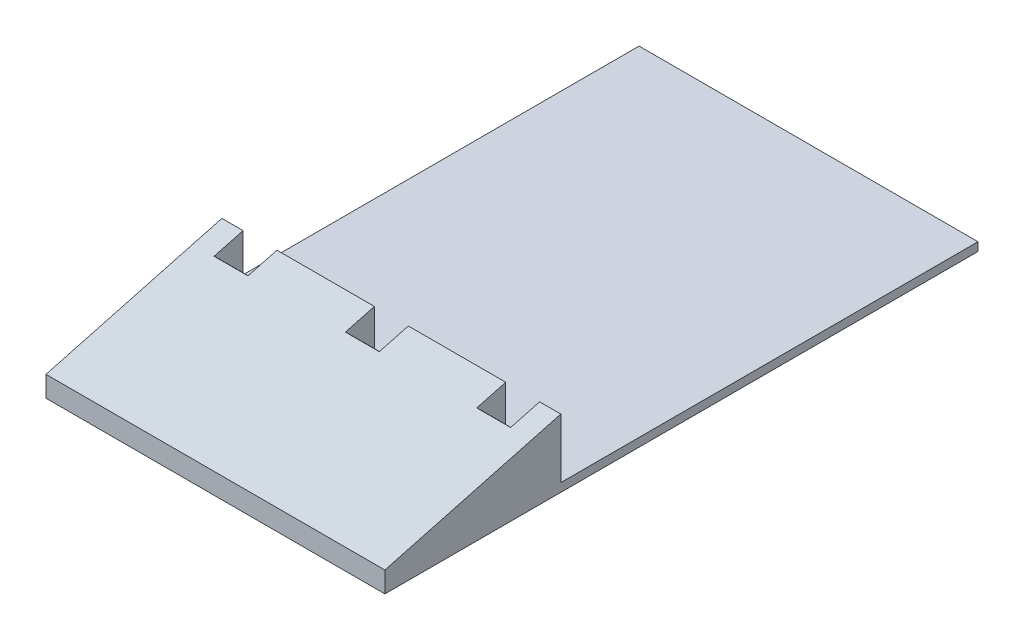
ISO-10303-21;
HEADER;
FILE_DESCRIPTION(('STEP AP214'),'2;1');
FILE_NAME('part.step','',(''),(''),'','','');
FILE_SCHEMA(('AUTOMOTIVE_DESIGN { 1 0 10303 214 1 1 1 1 }'));
ENDSEC;
DATA;
#1=APPLICATION_CONTEXT('core data for automotive mechanical design processes');
#2=APPLICATION_PROTOCOL_DEFINITION('international standard','automotive_design',2000,#1);
#3=PRODUCT_CONTEXT('',#1,'mechanical');
#4=PRODUCT('Part','Part','',(#3));
#5=PRODUCT_RELATED_PRODUCT_CATEGORY('part','',(#4));
#6=PRODUCT_DEFINITION_FORMATION('','',#4);
#7=PRODUCT_DEFINITION_CONTEXT('part definition',#1,'design');
#8=PRODUCT_DEFINITION('design','',#6,#7);
#9=PRODUCT_DEFINITION_SHAPE('','',#8);
#10=(LENGTH_UNIT() NAMED_UNIT(*) SI_UNIT(.MILLI.,.METRE.));
#11=(NAMED_UNIT(*) PLANE_ANGLE_UNIT() SI_UNIT($,.RADIAN.));
#12=(NAMED_UNIT(*) SI_UNIT($,.STERADIAN.) SOLID_ANGLE_UNIT());
#13=UNCERTAINTY_MEASURE_WITH_UNIT(LENGTH_MEASURE(1.E-05),#10,'distance_accuracy_value','');
#14=(GEOMETRIC_REPRESENTATION_CONTEXT(3) GLOBAL_UNCERTAINTY_ASSIGNED_CONTEXT((#13)) GLOBAL_UNIT_ASSIGNED_CONTEXT((#10,
#11,#12)) REPRESENTATION_CONTEXT('',''));
#15=CARTESIAN_POINT('',(0.,0.,0.));
#16=DIRECTION('',(0.,0.,1.));
#17=DIRECTION('',(1.,0.,0.));
#18=AXIS2_PLACEMENT_3D('',#15,#16,#17);
#19=CARTESIAN_POINT('',(-200.,80.077464993119,-207.601036066479));
#20=DIRECTION('',(0.,0.,-1.));
#21=DIRECTION('',(-1.,0.,0.));
#22=AXIS2_PLACEMENT_3D('',#19,#20,#21);
#23=PLANE('',#22);
#24=DIRECTION('',(1.,0.,0.));
#25=VECTOR('',#24,1.);
#26=CARTESIAN_POINT('',(-200.,80.077464993119,-207.601036066479));
#27=LINE('',#26,#25);
#28=CARTESIAN_POINT('',(-200.,80.077464993119,-207.601036066479));
#29=VERTEX_POINT('',#28);
#30=CARTESIAN_POINT('',(-175.,80.077464993119,-207.601036066479));
#31=VERTEX_POINT('',#30);
#32=EDGE_CURVE('E539',#29,#31,#27,.T.);
#33=ORIENTED_EDGE('',*,*,#32,.T.);
#34=DIRECTION('',(0.,1.,0.));
#35=VECTOR('',#34,1.);
#36=CARTESIAN_POINT('',(-175.,10.,-207.601036066479));
#37=LINE('',#36,#35);
#38=CARTESIAN_POINT('',(-175.,10.,-207.601036066479));
#39=VERTEX_POINT('',#38);
#40=EDGE_CURVE('E444',#39,#31,#37,.T.);
#41=ORIENTED_EDGE('',*,*,#40,.F.);
#42=DIRECTION('',(-1.,0.,0.));
#43=VECTOR('',#42,1.);
#44=CARTESIAN_POINT('',(0.,10.,-207.601036066479));
#45=LINE('',#44,#43);
#46=CARTESIAN_POINT('',(-200.,10.,-207.601036066479));
#47=VERTEX_POINT('',#46);
#48=EDGE_CURVE('E538',#39,#47,#45,.T.);
#49=ORIENTED_EDGE('',*,*,#48,.T.);
#50=DIRECTION('',(0.,1.,0.));
#51=VECTOR('',#50,1.);
#52=CARTESIAN_POINT('',(-200.,80.077464993119,-207.601036066479));
#53=LINE('',#52,#51);
#54=EDGE_CURVE('E526',#47,#29,#53,.T.);
#55=ORIENTED_EDGE('',*,*,#54,.T.);
#56=EDGE_LOOP('',(#33,#41,#49,#55));
#57=FACE_BOUND('',#56,.T.);
#58=ADVANCED_FACE('F46',(#57),#23,.T.);
#59=CARTESIAN_POINT('',(-200.,24.4644117044917,0.));
#60=DIRECTION('',(0.,0.965941500833546,0.258760539819032));
#61=DIRECTION('',(0.,-0.258760539819032,0.965941500833546));
#62=AXIS2_PLACEMENT_3D('',#59,#60,#61);
#63=PLANE('',#62);
#64=DIRECTION('',(0.,-0.258760539819032,0.965941500833546));
#65=VECTOR('',#64,1.);
#66=CARTESIAN_POINT('',(-135.,80.077464993119,-207.601036066479));
#67=LINE('',#66,#65);
#68=CARTESIAN_POINT('',(-135.,80.077464993119,-207.601036066479));
#69=VERTEX_POINT('',#68);
#70=CARTESIAN_POINT('',(-135.,70.9185634064497,-173.411266827316));
#71=VERTEX_POINT('',#70);
#72=EDGE_CURVE('E459',#69,#71,#67,.T.);
#73=ORIENTED_EDGE('',*,*,#72,.T.);
#74=DIRECTION('',(-1.,0.,0.));
#75=VECTOR('',#74,1.);
#76=CARTESIAN_POINT('',(-135.,70.9185634064497,-173.411266827316));
#77=LINE('',#76,#75);
#78=CARTESIAN_POINT('',(-175.,70.9185634064497,-173.411266827316));
#79=VERTEX_POINT('',#78);
#80=EDGE_CURVE('E463',#71,#79,#77,.T.);
#81=ORIENTED_EDGE('',*,*,#80,.T.);
#82=DIRECTION('',(0.,-0.258760539819032,0.965941500833546));
#83=VECTOR('',#82,1.);
#84=CARTESIAN_POINT('',(-175.,80.077464993119,-207.601036066479));
#85=LINE('',#84,#83);
#86=EDGE_CURVE('E447',#31,#79,#85,.T.);
#87=ORIENTED_EDGE('',*,*,#86,.F.);
#88=ORIENTED_EDGE('',*,*,#32,.F.);
#89=DIRECTION('',(0.,-0.258760539819032,0.965941500833546));
#90=VECTOR('',#89,1.);
#91=CARTESIAN_POINT('',(-200.,51.6292787330018,-101.405231438355));
#92=LINE('',#91,#90);
#93=CARTESIAN_POINT('',(-200.,24.4644117044917,0.));
#94=VERTEX_POINT('',#93);
#95=EDGE_CURVE('E529',#29,#94,#92,.T.);
#96=ORIENTED_EDGE('',*,*,#95,.T.);
#97=DIRECTION('',(1.,0.,0.));
#98=VECTOR('',#97,1.);
#99=CARTESIAN_POINT('',(-200.,24.4644117044917,0.));
#100=LINE('',#99,#98);
#101=CARTESIAN_POINT('',(200.,24.4644117044917,0.));
#102=VERTEX_POINT('',#101);
#103=EDGE_CURVE('E534',#94,#102,#100,.T.);
#104=ORIENTED_EDGE('',*,*,#103,.T.);
#105=DIRECTION('',(0.,-0.258760539819032,0.965941500833546));
#106=VECTOR('',#105,1.);
#107=CARTESIAN_POINT('',(200.,51.6292787330018,-101.405231438355));
#108=LINE('',#107,#106);
#109=CARTESIAN_POINT('',(200.,80.077464993119,-207.601036066479));
#110=VERTEX_POINT('',#109);
#111=EDGE_CURVE('E522',#110,#102,#108,.T.);
#112=ORIENTED_EDGE('',*,*,#111,.F.);
#113=CARTESIAN_POINT('',(175.,80.077464993119,-207.601036066479));
#114=VERTEX_POINT('',#113);
#115=EDGE_CURVE('E533',#114,#110,#27,.T.);
#116=ORIENTED_EDGE('',*,*,#115,.F.);
#117=DIRECTION('',(0.,-0.258760539819032,0.965941500833546));
#118=VECTOR('',#117,1.);
#119=CARTESIAN_POINT('',(175.,24.4644117044917,0.));
#120=LINE('',#119,#118);
#121=CARTESIAN_POINT('',(175.,70.9185634064497,-173.411266827316));
#122=VERTEX_POINT('',#121);
#123=EDGE_CURVE('E496',#114,#122,#120,.T.);
#124=ORIENTED_EDGE('',*,*,#123,.T.);
#125=DIRECTION('',(-1.,0.,0.));
#126=VECTOR('',#125,1.);
#127=CARTESIAN_POINT('',(175.,70.9185634064497,-173.411266827316));
#128=LINE('',#127,#126);
#129=CARTESIAN_POINT('',(135.,70.9185634064497,-173.411266827316));
#130=VERTEX_POINT('',#129);
#131=EDGE_CURVE('E485',#122,#130,#128,.T.);
#132=ORIENTED_EDGE('',*,*,#131,.T.);
#133=DIRECTION('',(0.,-0.258760539819032,0.965941500833546));
#134=VECTOR('',#133,1.);
#135=CARTESIAN_POINT('',(135.,24.4644117044917,0.));
#136=LINE('',#135,#134);
#137=CARTESIAN_POINT('',(135.,80.077464993119,-207.601036066479));
#138=VERTEX_POINT('',#137);
#139=EDGE_CURVE('E493',#138,#130,#136,.T.);
#140=ORIENTED_EDGE('',*,*,#139,.F.);
#141=CARTESIAN_POINT('',(20.,80.077464993119,-207.601036066479));
#142=VERTEX_POINT('',#141);
#143=EDGE_CURVE('E544',#142,#138,#27,.T.);
#144=ORIENTED_EDGE('',*,*,#143,.F.);
#145=DIRECTION('',(0.,0.258760539819032,-0.965941500833546));
#146=VECTOR('',#145,1.);
#147=CARTESIAN_POINT('',(20.,24.4644117044917,0.));
#148=LINE('',#147,#146);
#149=CARTESIAN_POINT('',(20.,70.9185634064497,-173.411266827316));
#150=VERTEX_POINT('',#149);
#151=EDGE_CURVE('E515',#150,#142,#148,.T.);
#152=ORIENTED_EDGE('',*,*,#151,.F.);
#153=DIRECTION('',(-1.,0.,0.));
#154=VECTOR('',#153,1.);
#155=CARTESIAN_POINT('',(20.,70.9185634064497,-173.411266827316));
#156=LINE('',#155,#154);
#157=CARTESIAN_POINT('',(-20.,70.9185634064497,-173.411266827316));
#158=VERTEX_POINT('',#157);
#159=EDGE_CURVE('E507',#150,#158,#156,.T.);
#160=ORIENTED_EDGE('',*,*,#159,.T.);
#161=DIRECTION('',(0.,0.258760539819032,-0.965941500833546));
#162=VECTOR('',#161,1.);
#163=CARTESIAN_POINT('',(-20.,24.4644117044917,0.));
#164=LINE('',#163,#162);
#165=CARTESIAN_POINT('',(-20.,80.077464993119,-207.601036066479));
#166=VERTEX_POINT('',#165);
#167=EDGE_CURVE('E511',#158,#166,#164,.T.);
#168=ORIENTED_EDGE('',*,*,#167,.T.);
#169=EDGE_CURVE('E543',#69,#166,#27,.T.);
#170=ORIENTED_EDGE('',*,*,#169,.F.);
#171=EDGE_LOOP('',(#73,#81,#87,#88,#96,#104,#112,#116,#124,#132,#140,#144,#152,#160,#168,#170));
#172=FACE_BOUND('',#171,.T.);
#173=ADVANCED_FACE('F672',(#172),#63,.T.);
#174=CARTESIAN_POINT('',(200.,10.,-207.601036066479));
#175=VERTEX_POINT('',#174);
#176=CARTESIAN_POINT('',(175.,10.,-207.601036066479));
#177=VERTEX_POINT('',#176);
#178=EDGE_CURVE('E545',#175,#177,#45,.T.);
#179=ORIENTED_EDGE('',*,*,#178,.T.);
#180=DIRECTION('',(0.,-1.,0.));
#181=VECTOR('',#180,1.);
#182=CARTESIAN_POINT('',(175.,80.077464993119,-207.601036066479));
#183=LINE('',#182,#181);
#184=EDGE_CURVE('E481',#114,#177,#183,.T.);
#185=ORIENTED_EDGE('',*,*,#184,.F.);
#186=ORIENTED_EDGE('',*,*,#115,.T.);
#187=DIRECTION('',(0.,1.,0.));
#188=VECTOR('',#187,1.);
#189=CARTESIAN_POINT('',(200.,80.077464993119,-207.601036066479));
#190=LINE('',#189,#188);
#191=EDGE_CURVE('E518',#175,#110,#190,.T.);
#192=ORIENTED_EDGE('',*,*,#191,.F.);
#193=EDGE_LOOP('',(#179,#185,#186,#192));
#194=FACE_BOUND('',#193,.T.);
#195=ADVANCED_FACE('F686',(#194),#23,.T.);
#196=CARTESIAN_POINT('',(-200.,10.,0.));
#197=DIRECTION('',(0.,0.,-1.));
#198=DIRECTION('',(-1.,0.,0.));
#199=AXIS2_PLACEMENT_3D('',#196,#197,#198);
#200=PLANE('',#199);
#201=DIRECTION('',(1.,0.,0.));
#202=VECTOR('',#201,1.);
#203=CARTESIAN_POINT('',(-200.,0.,0.));
#204=LINE('',#203,#202);
#205=CARTESIAN_POINT('',(-200.,0.,0.));
#206=VERTEX_POINT('',#205);
#207=CARTESIAN_POINT('',(200.,0.,0.));
#208=VERTEX_POINT('',#207);
#209=EDGE_CURVE('E549',#206,#208,#204,.T.);
#210=ORIENTED_EDGE('',*,*,#209,.T.);
#211=DIRECTION('',(0.,-1.,0.));
#212=VECTOR('',#211,1.);
#213=CARTESIAN_POINT('',(200.,10.,0.));
#214=LINE('',#213,#212);
#215=EDGE_CURVE('E586',#102,#208,#214,.T.);
#216=ORIENTED_EDGE('',*,*,#215,.F.);
#217=ORIENTED_EDGE('',*,*,#103,.F.);
#218=DIRECTION('',(0.,-1.,0.));
#219=VECTOR('',#218,1.);
#220=CARTESIAN_POINT('',(-200.,10.,0.));
#221=LINE('',#220,#219);
#222=EDGE_CURVE('E563',#94,#206,#221,.T.);
#223=ORIENTED_EDGE('',*,*,#222,.T.);
#224=EDGE_LOOP('',(#210,#216,#217,#223));
#225=FACE_BOUND('',#224,.T.);
#226=ADVANCED_FACE('F693',(#225),#200,.F.);
#227=CARTESIAN_POINT('',(200.,10.,0.));
#228=DIRECTION('',(-1.,0.,0.));
#229=DIRECTION('',(0.,0.,1.));
#230=AXIS2_PLACEMENT_3D('',#227,#228,#229);
#231=PLANE('',#230);
#232=DIRECTION('',(0.,0.,-1.));
#233=VECTOR('',#232,1.);
#234=CARTESIAN_POINT('',(200.,10.,0.));
#235=LINE('',#234,#233);
#236=CARTESIAN_POINT('',(200.,10.,-700.));
#237=VERTEX_POINT('',#236);
#238=EDGE_CURVE('E552',#175,#237,#235,.T.);
#239=ORIENTED_EDGE('',*,*,#238,.F.);
#240=ORIENTED_EDGE('',*,*,#191,.T.);
#241=ORIENTED_EDGE('',*,*,#111,.T.);
#242=ORIENTED_EDGE('',*,*,#215,.T.);
#243=DIRECTION('',(0.,0.,-1.));
#244=VECTOR('',#243,1.);
#245=CARTESIAN_POINT('',(200.,0.,0.));
#246=LINE('',#245,#244);
#247=CARTESIAN_POINT('',(200.,0.,-700.));
#248=VERTEX_POINT('',#247);
#249=EDGE_CURVE('E567',#208,#248,#246,.T.);
#250=ORIENTED_EDGE('',*,*,#249,.T.);
#251=DIRECTION('',(0.,-1.,0.));
#252=VECTOR('',#251,1.);
#253=CARTESIAN_POINT('',(200.,10.,-700.));
#254=LINE('',#253,#252);
#255=EDGE_CURVE('E582',#237,#248,#254,.T.);
#256=ORIENTED_EDGE('',*,*,#255,.F.);
#257=EDGE_LOOP('',(#239,#240,#241,#242,#250,#256));
#258=FACE_BOUND('',#257,.T.);
#259=ADVANCED_FACE('F689',(#258),#231,.F.);
#260=CARTESIAN_POINT('',(200.,10.,-700.));
#261=DIRECTION('',(0.,0.,1.));
#262=DIRECTION('',(1.,0.,0.));
#263=AXIS2_PLACEMENT_3D('',#260,#261,#262);
#264=PLANE('',#263);
#265=DIRECTION('',(-1.,0.,0.));
#266=VECTOR('',#265,1.);
#267=CARTESIAN_POINT('',(200.,0.,-700.));
#268=LINE('',#267,#266);
#269=CARTESIAN_POINT('',(-200.,0.,-700.));
#270=VERTEX_POINT('',#269);
#271=EDGE_CURVE('E570',#248,#270,#268,.T.);
#272=ORIENTED_EDGE('',*,*,#271,.T.);
#273=DIRECTION('',(0.,-1.,0.));
#274=VECTOR('',#273,1.);
#275=CARTESIAN_POINT('',(-200.,10.,-700.));
#276=LINE('',#275,#274);
#277=CARTESIAN_POINT('',(-200.,10.,-700.));
#278=VERTEX_POINT('',#277);
#279=EDGE_CURVE('E578',#278,#270,#276,.T.);
#280=ORIENTED_EDGE('',*,*,#279,.F.);
#281=DIRECTION('',(-1.,0.,0.));
#282=VECTOR('',#281,1.);
#283=CARTESIAN_POINT('',(200.,10.,-700.));
#284=LINE('',#283,#282);
#285=EDGE_CURVE('E555',#237,#278,#284,.T.);
#286=ORIENTED_EDGE('',*,*,#285,.F.);
#287=ORIENTED_EDGE('',*,*,#255,.T.);
#288=EDGE_LOOP('',(#272,#280,#286,#287));
#289=FACE_BOUND('',#288,.T.);
#290=ADVANCED_FACE('F699',(#289),#264,.F.);
#291=CARTESIAN_POINT('',(-200.,10.,-700.));
#292=DIRECTION('',(1.,0.,0.));
#293=DIRECTION('',(0.,0.,-1.));
#294=AXIS2_PLACEMENT_3D('',#291,#292,#293);
#295=PLANE('',#294);
#296=DIRECTION('',(0.,0.,1.));
#297=VECTOR('',#296,1.);
#298=CARTESIAN_POINT('',(-200.,0.,-700.));
#299=LINE('',#298,#297);
#300=EDGE_CURVE('E556',#270,#206,#299,.T.);
#301=ORIENTED_EDGE('',*,*,#300,.T.);
#302=ORIENTED_EDGE('',*,*,#222,.F.);
#303=ORIENTED_EDGE('',*,*,#95,.F.);
#304=ORIENTED_EDGE('',*,*,#54,.F.);
#305=DIRECTION('',(0.,0.,1.));
#306=VECTOR('',#305,1.);
#307=CARTESIAN_POINT('',(-200.,10.,-700.));
#308=LINE('',#307,#306);
#309=EDGE_CURVE('E559',#278,#47,#308,.T.);
#310=ORIENTED_EDGE('',*,*,#309,.F.);
#311=ORIENTED_EDGE('',*,*,#279,.T.);
#312=EDGE_LOOP('',(#301,#302,#303,#304,#310,#311));
#313=FACE_BOUND('',#312,.T.);
#314=ADVANCED_FACE('F704',(#313),#295,.F.);
#315=CARTESIAN_POINT('',(0.,10.,0.));
#316=DIRECTION('',(0.,1.,0.));
#317=DIRECTION('',(0.,0.,1.));
#318=AXIS2_PLACEMENT_3D('',#315,#316,#317);
#319=PLANE('',#318);
#320=ORIENTED_EDGE('',*,*,#178,.F.);
#321=ORIENTED_EDGE('',*,*,#238,.T.);
#322=ORIENTED_EDGE('',*,*,#285,.T.);
#323=ORIENTED_EDGE('',*,*,#309,.T.);
#324=ORIENTED_EDGE('',*,*,#48,.F.);
#325=DIRECTION('',(-1.,0.,0.));
#326=VECTOR('',#325,1.);
#327=CARTESIAN_POINT('',(-135.,10.,-207.601036066479));
#328=LINE('',#327,#326);
#329=CARTESIAN_POINT('',(-135.,10.,-207.601036066479));
#330=VERTEX_POINT('',#329);
#331=EDGE_CURVE('E467',#330,#39,#328,.T.);
#332=ORIENTED_EDGE('',*,*,#331,.F.);
#333=CARTESIAN_POINT('',(-124.5,10.,-207.601036066479));
#334=VERTEX_POINT('',#333);
#335=EDGE_CURVE('E551',#334,#330,#45,.T.);
#336=ORIENTED_EDGE('',*,*,#335,.F.);
#337=CARTESIAN_POINT('',(-30.5,10.,-207.601036066479));
#338=VERTEX_POINT('',#337);
#339=EDGE_CURVE('E635',#338,#334,#45,.T.);
#340=ORIENTED_EDGE('',*,*,#339,.F.);
#341=CARTESIAN_POINT('',(30.5,10.,-207.601036066479));
#342=VERTEX_POINT('',#341);
#343=EDGE_CURVE('E627',#342,#338,#45,.T.);
#344=ORIENTED_EDGE('',*,*,#343,.F.);
#345=CARTESIAN_POINT('',(124.5,10.,-207.601036066479));
#346=VERTEX_POINT('',#345);
#347=EDGE_CURVE('E631',#346,#342,#45,.T.);
#348=ORIENTED_EDGE('',*,*,#347,.F.);
#349=CARTESIAN_POINT('',(135.,10.,-207.601036066479));
#350=VERTEX_POINT('',#349);
#351=EDGE_CURVE('E550',#350,#346,#45,.T.);
#352=ORIENTED_EDGE('',*,*,#351,.F.);
#353=DIRECTION('',(-1.,0.,0.));
#354=VECTOR('',#353,1.);
#355=CARTESIAN_POINT('',(175.,10.,-207.601036066479));
#356=LINE('',#355,#354);
#357=EDGE_CURVE('E489',#177,#350,#356,.T.);
#358=ORIENTED_EDGE('',*,*,#357,.F.);
#359=EDGE_LOOP('',(#320,#321,#322,#323,#324,#332,#336,#340,#344,#348,#352,#358));
#360=FACE_BOUND('',#359,.T.);
#361=ADVANCED_FACE('F629',(#360),#319,.T.);
#362=CARTESIAN_POINT('',(0.,0.,0.));
#363=DIRECTION('',(0.,1.,0.));
#364=DIRECTION('',(0.,0.,1.));
#365=AXIS2_PLACEMENT_3D('',#362,#363,#364);
#366=PLANE('',#365);
#367=ORIENTED_EDGE('',*,*,#271,.F.);
#368=ORIENTED_EDGE('',*,*,#249,.F.);
#369=ORIENTED_EDGE('',*,*,#209,.F.);
#370=ORIENTED_EDGE('',*,*,#300,.F.);
#371=EDGE_LOOP('',(#367,#368,#369,#370));
#372=FACE_BOUND('',#371,.T.);
#373=ADVANCED_FACE('F702',(#372),#366,.F.);
#374=DIRECTION('',(0.,1.,0.));
#375=VECTOR('',#374,1.);
#376=CARTESIAN_POINT('',(-124.5,-9.04038398026468,-207.601036066479));
#377=LINE('',#376,#375);
#378=CARTESIAN_POINT('',(-124.5,69.2072414951751,-207.601036066479));
#379=VERTEX_POINT('',#378);
#380=EDGE_CURVE('E62',#334,#379,#377,.T.);
#381=ORIENTED_EDGE('',*,*,#380,.F.);
#382=ORIENTED_EDGE('',*,*,#335,.T.);
#383=DIRECTION('',(0.,1.,0.));
#384=VECTOR('',#383,1.);
#385=CARTESIAN_POINT('',(-135.,10.,-207.601036066479));
#386=LINE('',#385,#384);
#387=EDGE_CURVE('E455',#330,#69,#386,.T.);
#388=ORIENTED_EDGE('',*,*,#387,.T.);
#389=ORIENTED_EDGE('',*,*,#169,.T.);
#390=DIRECTION('',(0.,-1.,0.));
#391=VECTOR('',#390,1.);
#392=CARTESIAN_POINT('',(-20.,80.077464993119,-207.601036066479));
#393=LINE('',#392,#391);
#394=CARTESIAN_POINT('',(-20.,10.2742103827511,-207.601036066479));
#395=VERTEX_POINT('',#394);
#396=EDGE_CURVE('E590',#166,#395,#393,.T.);
#397=ORIENTED_EDGE('',*,*,#396,.T.);
#398=DIRECTION('',(-1.,0.,0.));
#399=VECTOR('',#398,1.);
#400=CARTESIAN_POINT('',(20.,10.2742103827512,-207.601036066479));
#401=LINE('',#400,#399);
#402=CARTESIAN_POINT('',(20.,10.2742103827511,-207.601036066479));
#403=VERTEX_POINT('',#402);
#404=EDGE_CURVE('E594',#395,#403,#401,.F.);
#405=ORIENTED_EDGE('',*,*,#404,.T.);
#406=DIRECTION('',(0.,-1.,0.));
#407=VECTOR('',#406,1.);
#408=CARTESIAN_POINT('',(20.,80.077464993119,-207.601036066479));
#409=LINE('',#408,#407);
#410=EDGE_CURVE('E598',#142,#403,#409,.T.);
#411=ORIENTED_EDGE('',*,*,#410,.F.);
#412=ORIENTED_EDGE('',*,*,#143,.T.);
#413=DIRECTION('',(0.,-1.,0.));
#414=VECTOR('',#413,1.);
#415=CARTESIAN_POINT('',(135.,80.077464993119,-207.601036066479));
#416=LINE('',#415,#414);
#417=EDGE_CURVE('E474',#138,#350,#416,.T.);
#418=ORIENTED_EDGE('',*,*,#417,.T.);
#419=ORIENTED_EDGE('',*,*,#351,.T.);
#420=DIRECTION('',(0.,-1.,0.));
#421=VECTOR('',#420,1.);
#422=CARTESIAN_POINT('',(124.5,-9.04038398026468,-207.601036066479));
#423=LINE('',#422,#421);
#424=CARTESIAN_POINT('',(124.5,69.2072414951751,-207.601036066479));
#425=VERTEX_POINT('',#424);
#426=EDGE_CURVE('E375',#425,#346,#423,.T.);
#427=ORIENTED_EDGE('',*,*,#426,.F.);
#428=DIRECTION('',(1.,0.,0.));
#429=VECTOR('',#428,1.);
#430=CARTESIAN_POINT('',(-200.,69.2072414951751,-207.601036066479));
#431=LINE('',#430,#429);
#432=CARTESIAN_POINT('',(30.5,69.2072414951751,-207.601036066479));
#433=VERTEX_POINT('',#432);
#434=EDGE_CURVE('E298',#433,#425,#431,.T.);
#435=ORIENTED_EDGE('',*,*,#434,.F.);
#436=DIRECTION('',(0.,-1.,0.));
#437=VECTOR('',#436,1.);
#438=CARTESIAN_POINT('',(30.5,80.077464993119,-207.601036066479));
#439=LINE('',#438,#437);
#440=EDGE_CURVE('E399',#433,#342,#439,.T.);
#441=ORIENTED_EDGE('',*,*,#440,.T.);
#442=ORIENTED_EDGE('',*,*,#343,.T.);
#443=DIRECTION('',(0.,-1.,0.));
#444=VECTOR('',#443,1.);
#445=CARTESIAN_POINT('',(-30.5,80.077464993119,-207.601036066479));
#446=LINE('',#445,#444);
#447=CARTESIAN_POINT('',(-30.5,69.2072414951751,-207.601036066479));
#448=VERTEX_POINT('',#447);
#449=EDGE_CURVE('E70',#448,#338,#446,.T.);
#450=ORIENTED_EDGE('',*,*,#449,.F.);
#451=DIRECTION('',(1.,0.,0.));
#452=VECTOR('',#451,1.);
#453=CARTESIAN_POINT('',(-200.,69.2072414951751,-207.601036066479));
#454=LINE('',#453,#452);
#455=EDGE_CURVE('E291',#379,#448,#454,.T.);
#456=ORIENTED_EDGE('',*,*,#455,.F.);
#457=EDGE_LOOP('',(#381,#382,#388,#389,#397,#405,#411,#412,#418,#419,#427,#435,#441,#442,#450,#456));
#458=FACE_BOUND('',#457,.T.);
#459=ADVANCED_FACE('F659',(#458),#23,.T.);
#460=CARTESIAN_POINT('',(20.,-9.09343662564019,-102.368463878215));
#461=DIRECTION('',(-1.,0.,0.));
#462=DIRECTION('',(0.,0.,1.));
#463=AXIS2_PLACEMENT_3D('',#460,#461,#462);
#464=CYLINDRICAL_SURFACE('',#463,107.);
#465=CARTESIAN_POINT('',(-20.,-9.09343662564019,-102.368463878215));
#466=DIRECTION('',(-1.,0.,0.));
#467=DIRECTION('',(0.,0.,-1.));
#468=AXIS2_PLACEMENT_3D('',#465,#466,#467);
#469=CIRCLE('',#468,107.);
#470=EDGE_CURVE('E500',#158,#395,#469,.T.);
#471=ORIENTED_EDGE('',*,*,#470,.F.);
#472=ORIENTED_EDGE('',*,*,#159,.F.);
#473=CARTESIAN_POINT('',(20.,-9.09343662564019,-102.368463878215));
#474=DIRECTION('',(-1.,0.,0.));
#475=DIRECTION('',(0.,0.,-1.));
#476=AXIS2_PLACEMENT_3D('',#473,#474,#475);
#477=CIRCLE('',#476,107.);
#478=EDGE_CURVE('E503',#150,#403,#477,.T.);
#479=ORIENTED_EDGE('',*,*,#478,.T.);
#480=ORIENTED_EDGE('',*,*,#404,.F.);
#481=EDGE_LOOP('',(#471,#472,#479,#480));
#482=FACE_BOUND('',#481,.T.);
#483=ADVANCED_FACE('F740',(#482),#464,.T.);
#484=CARTESIAN_POINT('',(20.,-9.09343662564019,-102.368463878215));
#485=DIRECTION('',(1.,0.,0.));
#486=DIRECTION('',(0.,0.,-1.));
#487=AXIS2_PLACEMENT_3D('',#484,#485,#486);
#488=PLANE('',#487);
#489=ORIENTED_EDGE('',*,*,#151,.T.);
#490=ORIENTED_EDGE('',*,*,#410,.T.);
#491=ORIENTED_EDGE('',*,*,#478,.F.);
#492=EDGE_LOOP('',(#489,#490,#491));
#493=FACE_BOUND('',#492,.T.);
#494=ADVANCED_FACE('F746',(#493),#488,.F.);
#495=CARTESIAN_POINT('',(-20.,-9.09343662564019,-102.368463878215));
#496=DIRECTION('',(1.,0.,0.));
#497=DIRECTION('',(0.,0.,-1.));
#498=AXIS2_PLACEMENT_3D('',#495,#496,#497);
#499=PLANE('',#498);
#500=ORIENTED_EDGE('',*,*,#470,.T.);
#501=ORIENTED_EDGE('',*,*,#396,.F.);
#502=ORIENTED_EDGE('',*,*,#167,.F.);
#503=EDGE_LOOP('',(#500,#501,#502));
#504=FACE_BOUND('',#503,.T.);
#505=ADVANCED_FACE('F728',(#504),#499,.T.);
#506=CARTESIAN_POINT('',(175.,-9.04038398026468,-102.308758202031));
#507=DIRECTION('',(-1.,0.,0.));
#508=DIRECTION('',(0.,0.,1.));
#509=AXIS2_PLACEMENT_3D('',#506,#507,#508);
#510=CYLINDRICAL_SURFACE('',#509,107.);
#511=ORIENTED_EDGE('',*,*,#131,.F.);
#512=CARTESIAN_POINT('',(175.,-9.04038398026468,-102.308758202031));
#513=DIRECTION('',(-1.,0.,0.));
#514=DIRECTION('',(0.,0.,1.));
#515=AXIS2_PLACEMENT_3D('',#512,#513,#514);
#516=CIRCLE('',#515,107.);
#517=EDGE_CURVE('E478',#122,#177,#516,.T.);
#518=ORIENTED_EDGE('',*,*,#517,.T.);
#519=ORIENTED_EDGE('',*,*,#357,.T.);
#520=CARTESIAN_POINT('',(135.,-9.04038398026468,-102.308758202031));
#521=DIRECTION('',(-1.,0.,0.));
#522=DIRECTION('',(0.,0.,1.));
#523=AXIS2_PLACEMENT_3D('',#520,#521,#522);
#524=CIRCLE('',#523,107.);
#525=EDGE_CURVE('E471',#130,#350,#524,.T.);
#526=ORIENTED_EDGE('',*,*,#525,.F.);
#527=EDGE_LOOP('',(#511,#518,#519,#526));
#528=FACE_BOUND('',#527,.T.);
#529=ADVANCED_FACE('F710',(#528),#510,.T.);
#530=CARTESIAN_POINT('',(175.,-9.04038398026468,-102.308758202031));
#531=DIRECTION('',(-1.,0.,0.));
#532=DIRECTION('',(0.,0.,1.));
#533=AXIS2_PLACEMENT_3D('',#530,#531,#532);
#534=PLANE('',#533);
#535=ORIENTED_EDGE('',*,*,#184,.T.);
#536=ORIENTED_EDGE('',*,*,#517,.F.);
#537=ORIENTED_EDGE('',*,*,#123,.F.);
#538=EDGE_LOOP('',(#535,#536,#537));
#539=FACE_BOUND('',#538,.T.);
#540=ADVANCED_FACE('F720',(#539),#534,.T.);
#541=CARTESIAN_POINT('',(135.,-9.04038398026468,-102.308758202031));
#542=DIRECTION('',(-1.,0.,0.));
#543=DIRECTION('',(0.,0.,1.));
#544=AXIS2_PLACEMENT_3D('',#541,#542,#543);
#545=PLANE('',#544);
#546=ORIENTED_EDGE('',*,*,#139,.T.);
#547=ORIENTED_EDGE('',*,*,#525,.T.);
#548=ORIENTED_EDGE('',*,*,#417,.F.);
#549=EDGE_LOOP('',(#546,#547,#548));
#550=FACE_BOUND('',#549,.T.);
#551=ADVANCED_FACE('F717',(#550),#545,.F.);
#552=CARTESIAN_POINT('',(-135.,-9.04038398026468,-102.308758202031));
#553=DIRECTION('',(-1.,0.,0.));
#554=DIRECTION('',(0.,0.,1.));
#555=AXIS2_PLACEMENT_3D('',#552,#553,#554);
#556=CYLINDRICAL_SURFACE('',#555,107.);
#557=ORIENTED_EDGE('',*,*,#80,.F.);
#558=CARTESIAN_POINT('',(-135.,-9.04038398026468,-102.308758202031));
#559=DIRECTION('',(-1.,0.,0.));
#560=DIRECTION('',(0.,0.,-1.));
#561=AXIS2_PLACEMENT_3D('',#558,#559,#560);
#562=CIRCLE('',#561,107.);
#563=EDGE_CURVE('E451',#71,#330,#562,.T.);
#564=ORIENTED_EDGE('',*,*,#563,.T.);
#565=ORIENTED_EDGE('',*,*,#331,.T.);
#566=CARTESIAN_POINT('',(-175.,-9.04038398026468,-102.308758202031));
#567=DIRECTION('',(-1.,0.,0.));
#568=DIRECTION('',(0.,0.,-1.));
#569=AXIS2_PLACEMENT_3D('',#566,#567,#568);
#570=CIRCLE('',#569,107.);
#571=EDGE_CURVE('E441',#79,#39,#570,.T.);
#572=ORIENTED_EDGE('',*,*,#571,.F.);
#573=EDGE_LOOP('',(#557,#564,#565,#572));
#574=FACE_BOUND('',#573,.T.);
#575=ADVANCED_FACE('F665',(#574),#556,.T.);
#576=CARTESIAN_POINT('',(-135.,-9.04038398026468,-102.308758202031));
#577=DIRECTION('',(1.,0.,0.));
#578=DIRECTION('',(0.,0.,-1.));
#579=AXIS2_PLACEMENT_3D('',#576,#577,#578);
#580=PLANE('',#579);
#581=ORIENTED_EDGE('',*,*,#563,.F.);
#582=ORIENTED_EDGE('',*,*,#72,.F.);
#583=ORIENTED_EDGE('',*,*,#387,.F.);
#584=EDGE_LOOP('',(#581,#582,#583));
#585=FACE_BOUND('',#584,.T.);
#586=ADVANCED_FACE('F676',(#585),#580,.F.);
#587=CARTESIAN_POINT('',(-175.,-9.04038398026468,-102.308758202031));
#588=DIRECTION('',(1.,0.,0.));
#589=DIRECTION('',(0.,0.,-1.));
#590=AXIS2_PLACEMENT_3D('',#587,#588,#589);
#591=PLANE('',#590);
#592=ORIENTED_EDGE('',*,*,#571,.T.);
#593=ORIENTED_EDGE('',*,*,#40,.T.);
#594=ORIENTED_EDGE('',*,*,#86,.T.);
#595=EDGE_LOOP('',(#592,#593,#594));
#596=FACE_BOUND('',#595,.T.);
#597=ADVANCED_FACE('F670',(#596),#591,.T.);
#598=CARTESIAN_POINT('',(30.5,-9.09343662564019,-102.368463878215));
#599=DIRECTION('',(1.,0.,0.));
#600=DIRECTION('',(0.,0.,-1.));
#601=AXIS2_PLACEMENT_3D('',#598,#599,#600);
#602=PLANE('',#601);
#603=DIRECTION('',(0.,0.,-1.));
#604=VECTOR('',#603,1.);
#605=CARTESIAN_POINT('',(30.5,10.5,0.));
#606=LINE('',#605,#604);
#607=CARTESIAN_POINT('',(30.5,10.5,-196.858395834995));
#608=VERTEX_POINT('',#607);
#609=CARTESIAN_POINT('',(30.5,10.5,-197.61354388876));
#610=VERTEX_POINT('',#609);
#611=EDGE_CURVE('E433',#608,#610,#606,.T.);
#612=ORIENTED_EDGE('',*,*,#611,.T.);
#613=CARTESIAN_POINT('',(30.5,-89.5,-197.61354388876));
#614=DIRECTION('',(1.,0.,0.));
#615=DIRECTION('',(0.,0.,-1.));
#616=AXIS2_PLACEMENT_3D('',#613,#614,#615);
#617=CIRCLE('',#616,100.);
#618=EDGE_CURVE('E55',#610,#342,#617,.F.);
#619=ORIENTED_EDGE('',*,*,#618,.T.);
#620=ORIENTED_EDGE('',*,*,#440,.F.);
#621=DIRECTION('',(0.,0.258760539819032,-0.965941500833546));
#622=VECTOR('',#621,1.);
#623=CARTESIAN_POINT('',(30.5,14.3220259457395,-2.71698566809984));
#624=LINE('',#623,#622);
#625=CARTESIAN_POINT('',(30.5,59.2638010627379,-170.482618468979));
#626=VERTEX_POINT('',#625);
#627=EDGE_CURVE('E336',#626,#433,#624,.T.);
#628=ORIENTED_EDGE('',*,*,#627,.F.);
#629=CARTESIAN_POINT('',(30.5,-9.09343662564019,-102.368463878215));
#630=DIRECTION('',(1.,0.,0.));
#631=DIRECTION('',(0.,0.,-1.));
#632=AXIS2_PLACEMENT_3D('',#629,#630,#631);
#633=CIRCLE('',#632,96.5);
#634=EDGE_CURVE('E345',#626,#608,#633,.F.);
#635=ORIENTED_EDGE('',*,*,#634,.T.);
#636=EDGE_LOOP('',(#612,#619,#620,#628,#635));
#637=FACE_BOUND('',#636,.T.);
#638=ADVANCED_FACE('F618',(#637),#602,.T.);
#639=CARTESIAN_POINT('',(-200.,80.077464993119,-197.101036066479));
#640=DIRECTION('',(0.,0.,-1.));
#641=DIRECTION('',(-1.,0.,0.));
#642=AXIS2_PLACEMENT_3D('',#639,#640,#641);
#643=PLANE('',#642);
#644=DIRECTION('',(0.,1.,0.));
#645=VECTOR('',#644,1.);
#646=CARTESIAN_POINT('',(-185.5,-9.04038398026468,-197.101036066479));
#647=LINE('',#646,#645);
#648=CARTESIAN_POINT('',(-185.5,10.5,-197.101036066479));
#649=VERTEX_POINT('',#648);
#650=CARTESIAN_POINT('',(-185.5,66.3944565948936,-197.101036066479));
#651=VERTEX_POINT('',#650);
#652=EDGE_CURVE('E264',#649,#651,#647,.T.);
#653=ORIENTED_EDGE('',*,*,#652,.T.);
#654=DIRECTION('',(1.,0.,0.));
#655=VECTOR('',#654,1.);
#656=CARTESIAN_POINT('',(-200.,66.3944565948936,-197.101036066479));
#657=LINE('',#656,#655);
#658=CARTESIAN_POINT('',(-189.5,66.3944565948936,-197.101036066479));
#659=VERTEX_POINT('',#658);
#660=EDGE_CURVE('E269',#659,#651,#657,.T.);
#661=ORIENTED_EDGE('',*,*,#660,.F.);
#662=DIRECTION('',(0.,1.,0.));
#663=VECTOR('',#662,1.);
#664=CARTESIAN_POINT('',(-189.5,10.,-197.101036066479));
#665=LINE('',#664,#663);
#666=CARTESIAN_POINT('',(-189.5,10.5,-197.101036066479));
#667=VERTEX_POINT('',#666);
#668=EDGE_CURVE('E301',#667,#659,#665,.T.);
#669=ORIENTED_EDGE('',*,*,#668,.F.);
#670=DIRECTION('',(-1.,0.,0.));
#671=VECTOR('',#670,1.);
#672=CARTESIAN_POINT('',(0.,10.5,-197.101036066479));
#673=LINE('',#672,#671);
#674=EDGE_CURVE('E271',#649,#667,#673,.T.);
#675=ORIENTED_EDGE('',*,*,#674,.F.);
#676=EDGE_LOOP('',(#653,#661,#669,#675));
#677=FACE_BOUND('',#676,.T.);
#678=ADVANCED_FACE('F266',(#677),#643,.F.);
#679=CARTESIAN_POINT('',(-200.,14.3220259457395,-2.71698566809984));
#680=DIRECTION('',(0.,0.965941500833546,0.258760539819032));
#681=DIRECTION('',(0.,-0.258760539819032,0.965941500833546));
#682=AXIS2_PLACEMENT_3D('',#679,#680,#681);
#683=PLANE('',#682);
#684=DIRECTION('',(0.,-0.258760539819032,0.965941500833546));
#685=VECTOR('',#684,1.);
#686=CARTESIAN_POINT('',(-124.5,37.6504676342389,-89.8010132113116));
#687=LINE('',#686,#685);
#688=CARTESIAN_POINT('',(-124.5,59.2624272053221,-170.477489920805));
#689=VERTEX_POINT('',#688);
#690=EDGE_CURVE('E305',#379,#689,#687,.T.);
#691=ORIENTED_EDGE('',*,*,#690,.F.);
#692=ORIENTED_EDGE('',*,*,#455,.T.);
#693=DIRECTION('',(0.,0.258760539819032,-0.965941500833546));
#694=VECTOR('',#693,1.);
#695=CARTESIAN_POINT('',(-30.5,14.3220259457395,-2.71698566809984));
#696=LINE('',#695,#694);
#697=CARTESIAN_POINT('',(-30.5,59.2638010627379,-170.482618468979));
#698=VERTEX_POINT('',#697);
#699=EDGE_CURVE('E340',#698,#448,#696,.T.);
#700=ORIENTED_EDGE('',*,*,#699,.F.);
#701=DIRECTION('',(-1.,0.,0.));
#702=VECTOR('',#701,1.);
#703=CARTESIAN_POINT('',(30.5,59.2638010627379,-170.482618468979));
#704=LINE('',#703,#702);
#705=EDGE_CURVE('E341',#626,#698,#704,.T.);
#706=ORIENTED_EDGE('',*,*,#705,.F.);
#707=ORIENTED_EDGE('',*,*,#627,.T.);
#708=ORIENTED_EDGE('',*,*,#434,.T.);
#709=DIRECTION('',(0.,-0.258760539819032,0.965941500833546));
#710=VECTOR('',#709,1.);
#711=CARTESIAN_POINT('',(124.5,14.3220259457395,-2.71698566809984));
#712=LINE('',#711,#710);
#713=CARTESIAN_POINT('',(124.5,59.2624272053221,-170.477489920805));
#714=VERTEX_POINT('',#713);
#715=EDGE_CURVE('E328',#425,#714,#712,.T.);
#716=ORIENTED_EDGE('',*,*,#715,.T.);
#717=DIRECTION('',(-1.,0.,0.));
#718=VECTOR('',#717,1.);
#719=CARTESIAN_POINT('',(185.5,59.2624272053221,-170.477489920805));
#720=LINE('',#719,#718);
#721=CARTESIAN_POINT('',(185.5,59.2624272053221,-170.477489920805));
#722=VERTEX_POINT('',#721);
#723=EDGE_CURVE('E329',#722,#714,#720,.T.);
#724=ORIENTED_EDGE('',*,*,#723,.F.);
#725=DIRECTION('',(0.,-0.258760539819032,0.965941500833546));
#726=VECTOR('',#725,1.);
#727=CARTESIAN_POINT('',(185.5,14.3220259457395,-2.71698566809984));
#728=LINE('',#727,#726);
#729=CARTESIAN_POINT('',(185.5,66.3944565948936,-197.101036066479));
#730=VERTEX_POINT('',#729);
#731=EDGE_CURVE('E323',#730,#722,#728,.T.);
#732=ORIENTED_EDGE('',*,*,#731,.F.);
#733=DIRECTION('',(1.,0.,0.));
#734=VECTOR('',#733,1.);
#735=CARTESIAN_POINT('',(-200.,66.3944565948936,-197.101036066479));
#736=LINE('',#735,#734);
#737=CARTESIAN_POINT('',(189.5,66.3944565948936,-197.101036066479));
#738=VERTEX_POINT('',#737);
#739=EDGE_CURVE('E314',#730,#738,#736,.T.);
#740=ORIENTED_EDGE('',*,*,#739,.T.);
#741=DIRECTION('',(0.,-0.258760539819032,0.965941500833546));
#742=VECTOR('',#741,1.);
#743=CARTESIAN_POINT('',(189.5,14.3220259457395,-2.71698566809984));
#744=LINE('',#743,#742);
#745=CARTESIAN_POINT('',(189.5,16.4069731068293,-10.5));
#746=VERTEX_POINT('',#745);
#747=EDGE_CURVE('E304',#738,#746,#744,.T.);
#748=ORIENTED_EDGE('',*,*,#747,.T.);
#749=DIRECTION('',(1.,0.,0.));
#750=VECTOR('',#749,1.);
#751=CARTESIAN_POINT('',(-200.,16.4069731068293,-10.4999999999999));
#752=LINE('',#751,#750);
#753=CARTESIAN_POINT('',(-189.5,16.4069731068293,-10.4999999999999));
#754=VERTEX_POINT('',#753);
#755=EDGE_CURVE('E290',#754,#746,#752,.T.);
#756=ORIENTED_EDGE('',*,*,#755,.F.);
#757=DIRECTION('',(0.,-0.258760539819032,0.965941500833546));
#758=VECTOR('',#757,1.);
#759=CARTESIAN_POINT('',(-189.5,188.316813018324,-652.231729607213));
#760=LINE('',#759,#758);
#761=EDGE_CURVE('E288',#659,#754,#760,.T.);
#762=ORIENTED_EDGE('',*,*,#761,.F.);
#763=ORIENTED_EDGE('',*,*,#660,.T.);
#764=DIRECTION('',(0.,-0.258760539819032,0.965941500833546));
#765=VECTOR('',#764,1.);
#766=CARTESIAN_POINT('',(-185.5,37.6504676342389,-89.8010132113116));
#767=LINE('',#766,#765);
#768=CARTESIAN_POINT('',(-185.5,59.2624272053221,-170.477489920805));
#769=VERTEX_POINT('',#768);
#770=EDGE_CURVE('E274',#651,#769,#767,.T.);
#771=ORIENTED_EDGE('',*,*,#770,.T.);
#772=DIRECTION('',(-1.,0.,0.));
#773=VECTOR('',#772,1.);
#774=CARTESIAN_POINT('',(-124.5,59.2624272053221,-170.477489920805));
#775=LINE('',#774,#773);
#776=EDGE_CURVE('E309',#689,#769,#775,.T.);
#777=ORIENTED_EDGE('',*,*,#776,.F.);
#778=EDGE_LOOP('',(#691,#692,#700,#706,#707,#708,#716,#724,#732,#740,#748,#756,#762,#763,#771,#777));
#779=FACE_BOUND('',#778,.T.);
#780=ADVANCED_FACE('F285',(#779),#683,.F.);
#781=DIRECTION('',(1.,0.,0.));
#782=VECTOR('',#781,1.);
#783=CARTESIAN_POINT('',(-200.,10.5,-197.101036066479));
#784=LINE('',#783,#782);
#785=CARTESIAN_POINT('',(185.5,10.5,-197.101036066479));
#786=VERTEX_POINT('',#785);
#787=CARTESIAN_POINT('',(189.5,10.5,-197.101036066479));
#788=VERTEX_POINT('',#787);
#789=EDGE_CURVE('E404',#786,#788,#784,.T.);
#790=ORIENTED_EDGE('',*,*,#789,.T.);
#791=DIRECTION('',(0.,1.,0.));
#792=VECTOR('',#791,1.);
#793=CARTESIAN_POINT('',(189.5,80.077464993119,-197.101036066479));
#794=LINE('',#793,#792);
#795=EDGE_CURVE('E319',#788,#738,#794,.T.);
#796=ORIENTED_EDGE('',*,*,#795,.T.);
#797=ORIENTED_EDGE('',*,*,#739,.F.);
#798=DIRECTION('',(0.,-1.,0.));
#799=VECTOR('',#798,1.);
#800=CARTESIAN_POINT('',(185.5,-9.04038398026468,-197.101036066479));
#801=LINE('',#800,#799);
#802=EDGE_CURVE('E333',#730,#786,#801,.T.);
#803=ORIENTED_EDGE('',*,*,#802,.T.);
#804=EDGE_LOOP('',(#790,#796,#797,#803));
#805=FACE_BOUND('',#804,.T.);
#806=ADVANCED_FACE('F806',(#805),#643,.F.);
#807=CARTESIAN_POINT('',(-200.,10.,-10.4999999999999));
#808=DIRECTION('',(0.,0.,-1.));
#809=DIRECTION('',(-1.,0.,0.));
#810=AXIS2_PLACEMENT_3D('',#807,#808,#809);
#811=PLANE('',#810);
#812=DIRECTION('',(1.,0.,0.));
#813=VECTOR('',#812,1.);
#814=CARTESIAN_POINT('',(-200.,10.5,-10.4999999999999));
#815=LINE('',#814,#813);
#816=CARTESIAN_POINT('',(-189.5,10.5,-10.4999999999999));
#817=VERTEX_POINT('',#816);
#818=CARTESIAN_POINT('',(189.5,10.5,-10.5));
#819=VERTEX_POINT('',#818);
#820=EDGE_CURVE('E296',#817,#819,#815,.T.);
#821=ORIENTED_EDGE('',*,*,#820,.F.);
#822=DIRECTION('',(0.,-1.,0.));
#823=VECTOR('',#822,1.);
#824=CARTESIAN_POINT('',(-189.5,10.,-10.4999999999999));
#825=LINE('',#824,#823);
#826=EDGE_CURVE('E358',#754,#817,#825,.T.);
#827=ORIENTED_EDGE('',*,*,#826,.F.);
#828=ORIENTED_EDGE('',*,*,#755,.T.);
#829=DIRECTION('',(0.,-1.,0.));
#830=VECTOR('',#829,1.);
#831=CARTESIAN_POINT('',(189.5,10.,-10.5));
#832=LINE('',#831,#830);
#833=EDGE_CURVE('E354',#746,#819,#832,.T.);
#834=ORIENTED_EDGE('',*,*,#833,.T.);
#835=EDGE_LOOP('',(#821,#827,#828,#834));
#836=FACE_BOUND('',#835,.T.);
#837=ADVANCED_FACE('F820',(#836),#811,.T.);
#838=CARTESIAN_POINT('',(189.5,10.,0.));
#839=DIRECTION('',(-1.,0.,0.));
#840=DIRECTION('',(0.,0.,1.));
#841=AXIS2_PLACEMENT_3D('',#838,#839,#840);
#842=PLANE('',#841);
#843=DIRECTION('',(0.,0.,-1.));
#844=VECTOR('',#843,1.);
#845=CARTESIAN_POINT('',(189.5,10.5,0.));
#846=LINE('',#845,#844);
#847=EDGE_CURVE('E359',#819,#788,#846,.T.);
#848=ORIENTED_EDGE('',*,*,#847,.F.);
#849=ORIENTED_EDGE('',*,*,#833,.F.);
#850=ORIENTED_EDGE('',*,*,#747,.F.);
#851=ORIENTED_EDGE('',*,*,#795,.F.);
#852=EDGE_LOOP('',(#848,#849,#850,#851));
#853=FACE_BOUND('',#852,.T.);
#854=ADVANCED_FACE('F829',(#853),#842,.T.);
#855=CARTESIAN_POINT('',(-189.5,10.,-700.));
#856=DIRECTION('',(1.,0.,0.));
#857=DIRECTION('',(0.,0.,-1.));
#858=AXIS2_PLACEMENT_3D('',#855,#856,#857);
#859=PLANE('',#858);
#860=ORIENTED_EDGE('',*,*,#668,.T.);
#861=ORIENTED_EDGE('',*,*,#761,.T.);
#862=ORIENTED_EDGE('',*,*,#826,.T.);
#863=DIRECTION('',(0.,0.,1.));
#864=VECTOR('',#863,1.);
#865=CARTESIAN_POINT('',(-189.5,10.5,-700.));
#866=LINE('',#865,#864);
#867=EDGE_CURVE('E363',#667,#817,#866,.T.);
#868=ORIENTED_EDGE('',*,*,#867,.F.);
#869=EDGE_LOOP('',(#860,#861,#862,#868));
#870=FACE_BOUND('',#869,.T.);
#871=ADVANCED_FACE('F838',(#870),#859,.T.);
#872=CARTESIAN_POINT('',(0.,10.5,0.));
#873=DIRECTION('',(0.,1.,0.));
#874=DIRECTION('',(0.,0.,1.));
#875=AXIS2_PLACEMENT_3D('',#872,#873,#874);
#876=PLANE('',#875);
#877=DIRECTION('',(0.,0.,-1.));
#878=VECTOR('',#877,1.);
#879=CARTESIAN_POINT('',(-30.5,10.5,0.));
#880=LINE('',#879,#878);
#881=CARTESIAN_POINT('',(-30.5,10.5,-196.858395834995));
#882=VERTEX_POINT('',#881);
#883=CARTESIAN_POINT('',(-30.5,10.5,-197.61354388876));
#884=VERTEX_POINT('',#883);
#885=EDGE_CURVE('E429',#882,#884,#880,.T.);
#886=ORIENTED_EDGE('',*,*,#885,.T.);
#887=DIRECTION('',(-1.,0.,0.));
#888=VECTOR('',#887,1.);
#889=CARTESIAN_POINT('',(-124.5,10.5,-197.61354388876));
#890=LINE('',#889,#888);
#891=CARTESIAN_POINT('',(-124.5,10.5,-197.61354388876));
#892=VERTEX_POINT('',#891);
#893=EDGE_CURVE('E605',#884,#892,#890,.T.);
#894=ORIENTED_EDGE('',*,*,#893,.T.);
#895=DIRECTION('',(0.,0.,-1.));
#896=VECTOR('',#895,1.);
#897=CARTESIAN_POINT('',(-124.5,10.5,0.));
#898=LINE('',#897,#896);
#899=CARTESIAN_POINT('',(-124.5,10.5,-196.809675625641));
#900=VERTEX_POINT('',#899);
#901=EDGE_CURVE('E422',#900,#892,#898,.T.);
#902=ORIENTED_EDGE('',*,*,#901,.F.);
#903=DIRECTION('',(-1.,0.,0.));
#904=VECTOR('',#903,1.);
#905=CARTESIAN_POINT('',(-135.,10.5,-196.809675625641));
#906=LINE('',#905,#904);
#907=CARTESIAN_POINT('',(-185.5,10.5,-196.809675625641));
#908=VERTEX_POINT('',#907);
#909=EDGE_CURVE('E414',#900,#908,#906,.T.);
#910=ORIENTED_EDGE('',*,*,#909,.T.);
#911=DIRECTION('',(0.,0.,-1.));
#912=VECTOR('',#911,1.);
#913=CARTESIAN_POINT('',(-185.5,10.5,0.));
#914=LINE('',#913,#912);
#915=EDGE_CURVE('E407',#908,#649,#914,.T.);
#916=ORIENTED_EDGE('',*,*,#915,.T.);
#917=ORIENTED_EDGE('',*,*,#674,.T.);
#918=ORIENTED_EDGE('',*,*,#867,.T.);
#919=ORIENTED_EDGE('',*,*,#820,.T.);
#920=ORIENTED_EDGE('',*,*,#847,.T.);
#921=ORIENTED_EDGE('',*,*,#789,.F.);
#922=DIRECTION('',(0.,0.,1.));
#923=VECTOR('',#922,1.);
#924=CARTESIAN_POINT('',(185.5,10.5,0.));
#925=LINE('',#924,#923);
#926=CARTESIAN_POINT('',(185.5,10.5,-196.809675625641));
#927=VERTEX_POINT('',#926);
#928=EDGE_CURVE('E410',#786,#927,#925,.T.);
#929=ORIENTED_EDGE('',*,*,#928,.T.);
#930=DIRECTION('',(-1.,0.,0.));
#931=VECTOR('',#930,1.);
#932=CARTESIAN_POINT('',(175.,10.5,-196.809675625641));
#933=LINE('',#932,#931);
#934=CARTESIAN_POINT('',(124.5,10.5,-196.809675625641));
#935=VERTEX_POINT('',#934);
#936=EDGE_CURVE('E418',#927,#935,#933,.T.);
#937=ORIENTED_EDGE('',*,*,#936,.T.);
#938=DIRECTION('',(0.,0.,1.));
#939=VECTOR('',#938,1.);
#940=CARTESIAN_POINT('',(124.5,10.5,0.));
#941=LINE('',#940,#939);
#942=CARTESIAN_POINT('',(124.5,10.5,-197.61354388876));
#943=VERTEX_POINT('',#942);
#944=EDGE_CURVE('E426',#943,#935,#941,.T.);
#945=ORIENTED_EDGE('',*,*,#944,.F.);
#946=DIRECTION('',(-1.,0.,0.));
#947=VECTOR('',#946,1.);
#948=CARTESIAN_POINT('',(30.5,10.5,-197.61354388876));
#949=LINE('',#948,#947);
#950=EDGE_CURVE('E601',#943,#610,#949,.T.);
#951=ORIENTED_EDGE('',*,*,#950,.T.);
#952=ORIENTED_EDGE('',*,*,#611,.F.);
#953=DIRECTION('',(-1.,0.,0.));
#954=VECTOR('',#953,1.);
#955=CARTESIAN_POINT('',(20.,10.5,-196.858395834995));
#956=LINE('',#955,#954);
#957=EDGE_CURVE('E437',#608,#882,#956,.T.);
#958=ORIENTED_EDGE('',*,*,#957,.T.);
#959=EDGE_LOOP('',(#886,#894,#902,#910,#916,#917,#918,#919,#920,#921,#929,#937,#945,#951,#952,#958));
#960=FACE_BOUND('',#959,.T.);
#961=ADVANCED_FACE('F654',(#960),#876,.T.);
#962=CARTESIAN_POINT('',(20.,-9.09343662564019,-102.368463878215));
#963=DIRECTION('',(-1.,0.,0.));
#964=DIRECTION('',(0.,0.,1.));
#965=AXIS2_PLACEMENT_3D('',#962,#963,#964);
#966=CYLINDRICAL_SURFACE('',#965,96.5);
#967=ORIENTED_EDGE('',*,*,#634,.F.);
#968=ORIENTED_EDGE('',*,*,#705,.T.);
#969=CARTESIAN_POINT('',(-30.5,-9.09343662564019,-102.368463878215));
#970=DIRECTION('',(1.,0.,0.));
#971=DIRECTION('',(0.,0.,-1.));
#972=AXIS2_PLACEMENT_3D('',#969,#970,#971);
#973=CIRCLE('',#972,96.5);
#974=EDGE_CURVE('E327',#698,#882,#973,.F.);
#975=ORIENTED_EDGE('',*,*,#974,.T.);
#976=ORIENTED_EDGE('',*,*,#957,.F.);
#977=EDGE_LOOP('',(#967,#968,#975,#976));
#978=FACE_BOUND('',#977,.T.);
#979=ADVANCED_FACE('F658',(#978),#966,.F.);
#980=CARTESIAN_POINT('',(-30.5,-9.09343662564019,-102.368463878215));
#981=DIRECTION('',(1.,0.,0.));
#982=DIRECTION('',(0.,0.,-1.));
#983=AXIS2_PLACEMENT_3D('',#980,#981,#982);
#984=PLANE('',#983);
#985=ORIENTED_EDGE('',*,*,#974,.F.);
#986=ORIENTED_EDGE('',*,*,#699,.T.);
#987=ORIENTED_EDGE('',*,*,#449,.T.);
#988=CARTESIAN_POINT('',(-30.5,-89.5,-197.61354388876));
#989=DIRECTION('',(1.,0.,0.));
#990=DIRECTION('',(0.,0.,-1.));
#991=AXIS2_PLACEMENT_3D('',#988,#989,#990);
#992=CIRCLE('',#991,100.);
#993=EDGE_CURVE('E612',#338,#884,#992,.T.);
#994=ORIENTED_EDGE('',*,*,#993,.T.);
#995=ORIENTED_EDGE('',*,*,#885,.F.);
#996=EDGE_LOOP('',(#985,#986,#987,#994,#995));
#997=FACE_BOUND('',#996,.T.);
#998=ADVANCED_FACE('F652',(#997),#984,.F.);
#999=CARTESIAN_POINT('',(175.,-9.04038398026468,-102.308758202031));
#1000=DIRECTION('',(-1.,0.,0.));
#1001=DIRECTION('',(0.,0.,1.));
#1002=AXIS2_PLACEMENT_3D('',#999,#1000,#1001);
#1003=CYLINDRICAL_SURFACE('',#1002,96.5);
#1004=CARTESIAN_POINT('',(185.5,-9.04038398026468,-102.308758202031));
#1005=DIRECTION('',(-1.,0.,0.));
#1006=DIRECTION('',(0.,0.,1.));
#1007=AXIS2_PLACEMENT_3D('',#1004,#1005,#1006);
#1008=CIRCLE('',#1007,96.5);
#1009=EDGE_CURVE('E351',#722,#927,#1008,.T.);
#1010=ORIENTED_EDGE('',*,*,#1009,.F.);
#1011=ORIENTED_EDGE('',*,*,#723,.T.);
#1012=CARTESIAN_POINT('',(124.5,-9.04038398026468,-102.308758202031));
#1013=DIRECTION('',(-1.,0.,0.));
#1014=DIRECTION('',(0.,0.,1.));
#1015=AXIS2_PLACEMENT_3D('',#1012,#1013,#1014);
#1016=CIRCLE('',#1015,96.5);
#1017=EDGE_CURVE('E311',#714,#935,#1016,.T.);
#1018=ORIENTED_EDGE('',*,*,#1017,.T.);
#1019=ORIENTED_EDGE('',*,*,#936,.F.);
#1020=EDGE_LOOP('',(#1010,#1011,#1018,#1019));
#1021=FACE_BOUND('',#1020,.T.);
#1022=ADVANCED_FACE('F860',(#1021),#1003,.F.);
#1023=CARTESIAN_POINT('',(185.5,-9.04038398026468,-102.308758202031));
#1024=DIRECTION('',(-1.,0.,0.));
#1025=DIRECTION('',(0.,0.,1.));
#1026=AXIS2_PLACEMENT_3D('',#1023,#1024,#1025);
#1027=PLANE('',#1026);
#1028=ORIENTED_EDGE('',*,*,#802,.F.);
#1029=ORIENTED_EDGE('',*,*,#731,.T.);
#1030=ORIENTED_EDGE('',*,*,#1009,.T.);
#1031=ORIENTED_EDGE('',*,*,#928,.F.);
#1032=EDGE_LOOP('',(#1028,#1029,#1030,#1031));
#1033=FACE_BOUND('',#1032,.T.);
#1034=ADVANCED_FACE('F864',(#1033),#1027,.F.);
#1035=CARTESIAN_POINT('',(124.5,-9.04038398026468,-102.308758202031));
#1036=DIRECTION('',(-1.,0.,0.));
#1037=DIRECTION('',(0.,0.,1.));
#1038=AXIS2_PLACEMENT_3D('',#1035,#1036,#1037);
#1039=PLANE('',#1038);
#1040=ORIENTED_EDGE('',*,*,#426,.T.);
#1041=CARTESIAN_POINT('',(124.5,-89.5,-197.61354388876));
#1042=DIRECTION('',(-1.,0.,0.));
#1043=DIRECTION('',(0.,0.,1.));
#1044=AXIS2_PLACEMENT_3D('',#1041,#1042,#1043);
#1045=CIRCLE('',#1044,100.);
#1046=EDGE_CURVE('E11',#346,#943,#1045,.F.);
#1047=ORIENTED_EDGE('',*,*,#1046,.T.);
#1048=ORIENTED_EDGE('',*,*,#944,.T.);
#1049=ORIENTED_EDGE('',*,*,#1017,.F.);
#1050=ORIENTED_EDGE('',*,*,#715,.F.);
#1051=EDGE_LOOP('',(#1040,#1047,#1048,#1049,#1050));
#1052=FACE_BOUND('',#1051,.T.);
#1053=ADVANCED_FACE('F873',(#1052),#1039,.T.);
#1054=CARTESIAN_POINT('',(-135.,-9.04038398026468,-102.308758202031));
#1055=DIRECTION('',(-1.,0.,0.));
#1056=DIRECTION('',(0.,0.,1.));
#1057=AXIS2_PLACEMENT_3D('',#1054,#1055,#1056);
#1058=CYLINDRICAL_SURFACE('',#1057,96.5);
#1059=CARTESIAN_POINT('',(-124.5,-9.04038398026468,-102.308758202031));
#1060=DIRECTION('',(1.,0.,0.));
#1061=DIRECTION('',(0.,0.,-1.));
#1062=AXIS2_PLACEMENT_3D('',#1059,#1060,#1061);
#1063=CIRCLE('',#1062,96.5);
#1064=EDGE_CURVE('E283',#689,#900,#1063,.F.);
#1065=ORIENTED_EDGE('',*,*,#1064,.F.);
#1066=ORIENTED_EDGE('',*,*,#776,.T.);
#1067=CARTESIAN_POINT('',(-185.5,-9.04038398026468,-102.308758202031));
#1068=DIRECTION('',(1.,0.,0.));
#1069=DIRECTION('',(0.,0.,-1.));
#1070=AXIS2_PLACEMENT_3D('',#1067,#1068,#1069);
#1071=CIRCLE('',#1070,96.5);
#1072=EDGE_CURVE('E275',#769,#908,#1071,.F.);
#1073=ORIENTED_EDGE('',*,*,#1072,.T.);
#1074=ORIENTED_EDGE('',*,*,#909,.F.);
#1075=EDGE_LOOP('',(#1065,#1066,#1073,#1074));
#1076=FACE_BOUND('',#1075,.T.);
#1077=ADVANCED_FACE('F773',(#1076),#1058,.F.);
#1078=CARTESIAN_POINT('',(-124.5,-9.04038398026468,-102.308758202031));
#1079=DIRECTION('',(1.,0.,0.));
#1080=DIRECTION('',(0.,0.,-1.));
#1081=AXIS2_PLACEMENT_3D('',#1078,#1079,#1080);
#1082=PLANE('',#1081);
#1083=ORIENTED_EDGE('',*,*,#901,.T.);
#1084=CARTESIAN_POINT('',(-124.5,-89.5,-197.61354388876));
#1085=DIRECTION('',(1.,0.,0.));
#1086=DIRECTION('',(0.,0.,-1.));
#1087=AXIS2_PLACEMENT_3D('',#1084,#1085,#1086);
#1088=CIRCLE('',#1087,100.);
#1089=EDGE_CURVE('E609',#892,#334,#1088,.F.);
#1090=ORIENTED_EDGE('',*,*,#1089,.T.);
#1091=ORIENTED_EDGE('',*,*,#380,.T.);
#1092=ORIENTED_EDGE('',*,*,#690,.T.);
#1093=ORIENTED_EDGE('',*,*,#1064,.T.);
#1094=EDGE_LOOP('',(#1083,#1090,#1091,#1092,#1093));
#1095=FACE_BOUND('',#1094,.T.);
#1096=ADVANCED_FACE('F662',(#1095),#1082,.T.);
#1097=CARTESIAN_POINT('',(-185.5,-9.04038398026468,-102.308758202031));
#1098=DIRECTION('',(1.,0.,0.));
#1099=DIRECTION('',(0.,0.,-1.));
#1100=AXIS2_PLACEMENT_3D('',#1097,#1098,#1099);
#1101=PLANE('',#1100);
#1102=ORIENTED_EDGE('',*,*,#1072,.F.);
#1103=ORIENTED_EDGE('',*,*,#770,.F.);
#1104=ORIENTED_EDGE('',*,*,#652,.F.);
#1105=ORIENTED_EDGE('',*,*,#915,.F.);
#1106=EDGE_LOOP('',(#1102,#1103,#1104,#1105));
#1107=FACE_BOUND('',#1106,.T.);
#1108=ADVANCED_FACE('F278',(#1107),#1101,.F.);
#1109=CARTESIAN_POINT('',(-200.,-89.5,-197.61354388876));
#1110=DIRECTION('',(1.,0.,0.));
#1111=DIRECTION('',(0.,0.,-1.));
#1112=AXIS2_PLACEMENT_3D('',#1109,#1110,#1111);
#1113=CYLINDRICAL_SURFACE('',#1112,100.);
#1114=ORIENTED_EDGE('',*,*,#993,.F.);
#1115=ORIENTED_EDGE('',*,*,#339,.T.);
#1116=ORIENTED_EDGE('',*,*,#1089,.F.);
#1117=ORIENTED_EDGE('',*,*,#893,.F.);
#1118=EDGE_LOOP('',(#1114,#1115,#1116,#1117));
#1119=FACE_BOUND('',#1118,.T.);
#1120=ADVANCED_FACE('F649',(#1119),#1113,.T.);
#1121=CARTESIAN_POINT('',(-200.,-89.5,-197.61354388876));
#1122=DIRECTION('',(1.,0.,0.));
#1123=DIRECTION('',(0.,0.,-1.));
#1124=AXIS2_PLACEMENT_3D('',#1121,#1122,#1123);
#1125=CYLINDRICAL_SURFACE('',#1124,100.);
#1126=ORIENTED_EDGE('',*,*,#1046,.F.);
#1127=ORIENTED_EDGE('',*,*,#347,.T.);
#1128=ORIENTED_EDGE('',*,*,#618,.F.);
#1129=ORIENTED_EDGE('',*,*,#950,.F.);
#1130=EDGE_LOOP('',(#1126,#1127,#1128,#1129));
#1131=FACE_BOUND('',#1130,.T.);
#1132=ADVANCED_FACE('F48',(#1131),#1125,.T.);
#1133=CLOSED_SHELL('',(#58,#173,#195,#226,#259,#290,#314,#361,#373,#459,#483,#494,#505,#529,
#540,#551,#575,#586,#597,#638,#678,#780,#806,#837,#854,#871,#961,#979,#998,#1022,#1034,#1053,
#1077,#1096,#1108,#1120,#1132));
#1134=MANIFOLD_SOLID_BREP('B2',#1133);
#1135=ADVANCED_BREP_SHAPE_REPRESENTATION('',(#18,#1134),#14);
#1136=SHAPE_DEFINITION_REPRESENTATION(#9,#1135);
ENDSEC;
END-ISO-10303-21;
